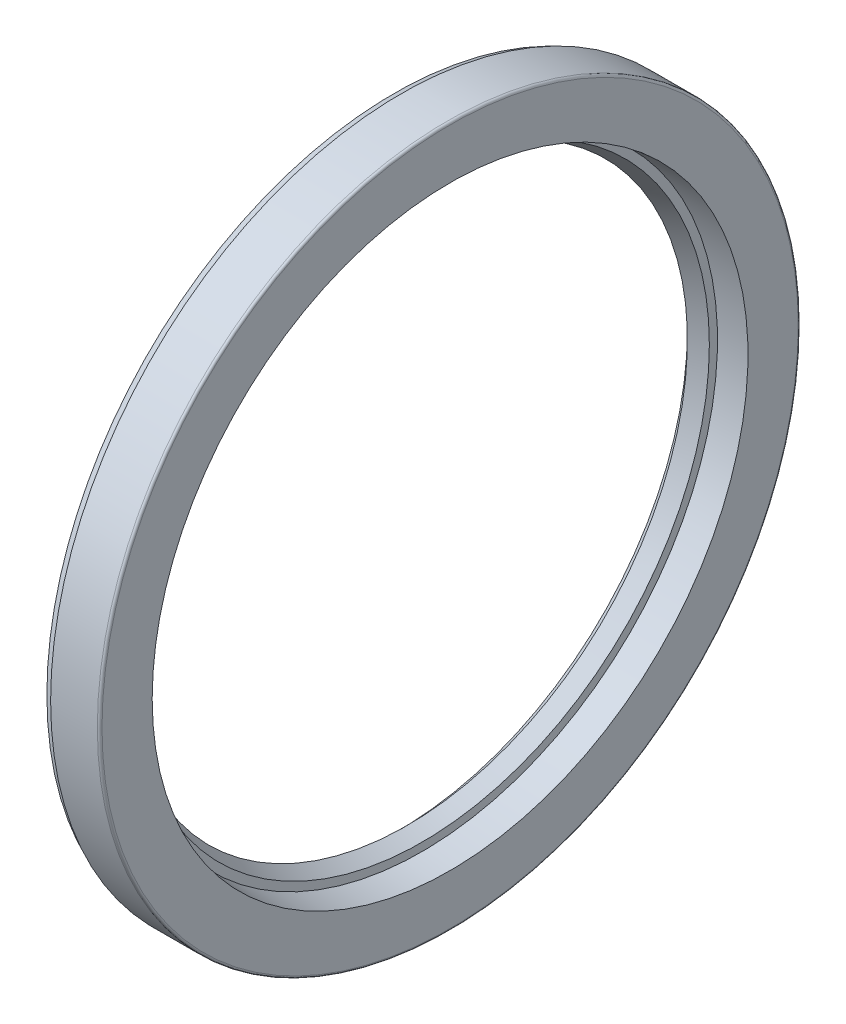
ISO-10303-21;
HEADER;
FILE_DESCRIPTION(('STEP AP214'),'2;1');
FILE_NAME('part.step','',(''),(''),'','','');
FILE_SCHEMA(('AUTOMOTIVE_DESIGN { 1 0 10303 214 1 1 1 1 }'));
ENDSEC;
DATA;
#1=APPLICATION_CONTEXT('core data for automotive mechanical design processes');
#2=APPLICATION_PROTOCOL_DEFINITION('international standard','automotive_design',2000,#1);
#3=PRODUCT_CONTEXT('',#1,'mechanical');
#4=PRODUCT('Part','Part','',(#3));
#5=PRODUCT_RELATED_PRODUCT_CATEGORY('part','',(#4));
#6=PRODUCT_DEFINITION_FORMATION('','',#4);
#7=PRODUCT_DEFINITION_CONTEXT('part definition',#1,'design');
#8=PRODUCT_DEFINITION('design','',#6,#7);
#9=PRODUCT_DEFINITION_SHAPE('','',#8);
#10=(LENGTH_UNIT() NAMED_UNIT(*) SI_UNIT(.MILLI.,.METRE.));
#11=(NAMED_UNIT(*) PLANE_ANGLE_UNIT() SI_UNIT($,.RADIAN.));
#12=(NAMED_UNIT(*) SI_UNIT($,.STERADIAN.) SOLID_ANGLE_UNIT());
#13=UNCERTAINTY_MEASURE_WITH_UNIT(LENGTH_MEASURE(1.E-05),#10,'distance_accuracy_value','');
#14=(GEOMETRIC_REPRESENTATION_CONTEXT(3) GLOBAL_UNCERTAINTY_ASSIGNED_CONTEXT((#13)) GLOBAL_UNIT_ASSIGNED_CONTEXT((#10,
#11,#12)) REPRESENTATION_CONTEXT('',''));
#15=CARTESIAN_POINT('',(0.,0.,0.));
#16=DIRECTION('',(0.,0.,1.));
#17=DIRECTION('',(1.,0.,0.));
#18=AXIS2_PLACEMENT_3D('',#15,#16,#17);
#19=CARTESIAN_POINT('',(-10.4988451556433,0.,0.));
#20=DIRECTION('',(1.,0.,0.));
#21=DIRECTION('',(0.,0.,-1.));
#22=AXIS2_PLACEMENT_3D('',#19,#20,#21);
#23=CONICAL_SURFACE('',#22,75.,0.43633231299858);
#24=CARTESIAN_POINT('',(-12.,0.,0.));
#25=DIRECTION('',(-1.,0.,0.));
#26=DIRECTION('',(0.,0.,1.));
#27=AXIS2_PLACEMENT_3D('',#24,#25,#26);
#28=CIRCLE('',#27,74.3);
#29=CARTESIAN_POINT('',(-12.,0.,74.3));
#30=VERTEX_POINT('',#29);
#31=EDGE_CURVE('E10',#30,#30,#28,.T.);
#32=ORIENTED_EDGE('',*,*,#31,.F.);
#33=EDGE_LOOP('',(#32));
#34=FACE_BOUND('',#33,.T.);
#35=CARTESIAN_POINT('',(-10.4988451556433,0.,0.));
#36=DIRECTION('',(-1.,0.,0.));
#37=DIRECTION('',(0.,0.,1.));
#38=AXIS2_PLACEMENT_3D('',#35,#36,#37);
#39=CIRCLE('',#38,75.);
#40=CARTESIAN_POINT('',(-10.4988451556433,0.,75.));
#41=VERTEX_POINT('',#40);
#42=EDGE_CURVE('E70',#41,#41,#39,.T.);
#43=ORIENTED_EDGE('',*,*,#42,.T.);
#44=EDGE_LOOP('',(#43));
#45=FACE_BOUND('',#44,.T.);
#46=ADVANCED_FACE('F15',(#34,#45),#23,.T.);
#47=CARTESIAN_POINT('',(-12.,74.3,0.));
#48=DIRECTION('',(1.,0.,0.));
#49=DIRECTION('',(0.,0.,-1.));
#50=AXIS2_PLACEMENT_3D('',#47,#48,#49);
#51=PLANE('',#50);
#52=CARTESIAN_POINT('',(-12.,0.,0.));
#53=DIRECTION('',(-1.,0.,0.));
#54=DIRECTION('',(0.,0.,1.));
#55=AXIS2_PLACEMENT_3D('',#52,#53,#54);
#56=CIRCLE('',#55,67.5);
#57=CARTESIAN_POINT('',(-12.,0.,67.5));
#58=VERTEX_POINT('',#57);
#59=EDGE_CURVE('E21',#58,#58,#56,.T.);
#60=ORIENTED_EDGE('',*,*,#59,.F.);
#61=EDGE_LOOP('',(#60));
#62=FACE_BOUND('',#61,.T.);
#63=ORIENTED_EDGE('',*,*,#31,.T.);
#64=EDGE_LOOP('',(#63));
#65=FACE_BOUND('',#64,.T.);
#66=ADVANCED_FACE('F161',(#62,#65),#51,.F.);
#67=CARTESIAN_POINT('',(-12.,0.,0.));
#68=DIRECTION('',(-1.,0.,0.));
#69=DIRECTION('',(0.,0.,1.));
#70=AXIS2_PLACEMENT_3D('',#67,#68,#69);
#71=CYLINDRICAL_SURFACE('',#70,67.5);
#72=CARTESIAN_POINT('',(-1.5,0.,0.));
#73=DIRECTION('',(-1.,0.,0.));
#74=DIRECTION('',(0.,0.,1.));
#75=AXIS2_PLACEMENT_3D('',#72,#73,#74);
#76=CIRCLE('',#75,67.5);
#77=CARTESIAN_POINT('',(-1.5,0.,67.5));
#78=VERTEX_POINT('',#77);
#79=EDGE_CURVE('E25',#78,#78,#76,.T.);
#80=ORIENTED_EDGE('',*,*,#79,.F.);
#81=EDGE_LOOP('',(#80));
#82=FACE_BOUND('',#81,.T.);
#83=ORIENTED_EDGE('',*,*,#59,.T.);
#84=EDGE_LOOP('',(#83));
#85=FACE_BOUND('',#84,.T.);
#86=ADVANCED_FACE('F156',(#82,#85),#71,.F.);
#87=CARTESIAN_POINT('',(-1.5,67.5,0.));
#88=DIRECTION('',(1.,0.,0.));
#89=DIRECTION('',(0.,0.,-1.));
#90=AXIS2_PLACEMENT_3D('',#87,#88,#89);
#91=PLANE('',#90);
#92=CARTESIAN_POINT('',(-1.5,0.,0.));
#93=DIRECTION('',(-1.,0.,0.));
#94=DIRECTION('',(0.,0.,1.));
#95=AXIS2_PLACEMENT_3D('',#92,#93,#94);
#96=CIRCLE('',#95,65.865);
#97=CARTESIAN_POINT('',(-1.5,0.,65.865));
#98=VERTEX_POINT('',#97);
#99=EDGE_CURVE('E29',#98,#98,#96,.T.);
#100=ORIENTED_EDGE('',*,*,#99,.F.);
#101=EDGE_LOOP('',(#100));
#102=FACE_BOUND('',#101,.T.);
#103=ORIENTED_EDGE('',*,*,#79,.T.);
#104=EDGE_LOOP('',(#103));
#105=FACE_BOUND('',#104,.T.);
#106=ADVANCED_FACE('F150',(#102,#105),#91,.F.);
#107=CARTESIAN_POINT('',(-1.5,0.,0.));
#108=DIRECTION('',(1.,0.,0.));
#109=DIRECTION('',(0.,0.,-1.));
#110=AXIS2_PLACEMENT_3D('',#107,#108,#109);
#111=CONICAL_SURFACE('',#110,65.865,0.261799387799145);
#112=CARTESIAN_POINT('',(-3.,0.,0.));
#113=DIRECTION('',(-1.,0.,0.));
#114=DIRECTION('',(0.,0.,1.));
#115=AXIS2_PLACEMENT_3D('',#112,#113,#114);
#116=CIRCLE('',#115,65.4630762113533);
#117=CARTESIAN_POINT('',(-3.,0.,65.4630762113533));
#118=VERTEX_POINT('',#117);
#119=EDGE_CURVE('E34',#118,#118,#116,.T.);
#120=ORIENTED_EDGE('',*,*,#119,.F.);
#121=EDGE_LOOP('',(#120));
#122=FACE_BOUND('',#121,.T.);
#123=ORIENTED_EDGE('',*,*,#99,.T.);
#124=EDGE_LOOP('',(#123));
#125=FACE_BOUND('',#124,.T.);
#126=ADVANCED_FACE('F144',(#122,#125),#111,.T.);
#127=CARTESIAN_POINT('',(-3.,65.4630762113533,0.));
#128=DIRECTION('',(1.,0.,0.));
#129=DIRECTION('',(0.,0.,-1.));
#130=AXIS2_PLACEMENT_3D('',#127,#128,#129);
#131=PLANE('',#130);
#132=CARTESIAN_POINT('',(-3.,0.,0.));
#133=DIRECTION('',(-1.,0.,0.));
#134=DIRECTION('',(0.,0.,1.));
#135=AXIS2_PLACEMENT_3D('',#132,#133,#134);
#136=CIRCLE('',#135,64.9);
#137=CARTESIAN_POINT('',(-3.,0.,64.9));
#138=VERTEX_POINT('',#137);
#139=EDGE_CURVE('E37',#138,#138,#136,.T.);
#140=ORIENTED_EDGE('',*,*,#139,.F.);
#141=EDGE_LOOP('',(#140));
#142=FACE_BOUND('',#141,.T.);
#143=ORIENTED_EDGE('',*,*,#119,.T.);
#144=EDGE_LOOP('',(#143));
#145=FACE_BOUND('',#144,.T.);
#146=ADVANCED_FACE('F138',(#142,#145),#131,.F.);
#147=CARTESIAN_POINT('',(-3.,0.,0.));
#148=DIRECTION('',(1.,0.,0.));
#149=DIRECTION('',(0.,0.,-1.));
#150=AXIS2_PLACEMENT_3D('',#147,#148,#149);
#151=CONICAL_SURFACE('',#150,64.9,0.087266462599712);
#152=CARTESIAN_POINT('',(-7.90076498212069,0.,0.));
#153=DIRECTION('',(-1.,0.,0.));
#154=DIRECTION('',(0.,0.,1.));
#155=AXIS2_PLACEMENT_3D('',#152,#153,#154);
#156=CIRCLE('',#155,64.4712386214596);
#157=CARTESIAN_POINT('',(-7.90076498212069,0.,64.4712386214596));
#158=VERTEX_POINT('',#157);
#159=EDGE_CURVE('E40',#158,#158,#156,.T.);
#160=ORIENTED_EDGE('',*,*,#159,.F.);
#161=EDGE_LOOP('',(#160));
#162=FACE_BOUND('',#161,.T.);
#163=ORIENTED_EDGE('',*,*,#139,.T.);
#164=EDGE_LOOP('',(#163));
#165=FACE_BOUND('',#164,.T.);
#166=ADVANCED_FACE('F132',(#162,#165),#151,.T.);
#167=CARTESIAN_POINT('',(-8.6,0.,0.));
#168=DIRECTION('',(-1.,0.,0.));
#169=DIRECTION('',(0.,0.,1.));
#170=AXIS2_PLACEMENT_3D('',#167,#168,#169);
#171=TOROIDAL_SURFACE('',#170,64.2,0.75);
#172=CARTESIAN_POINT('',(-8.9697265625,0.,0.));
#173=DIRECTION('',(-1.,0.,0.));
#174=DIRECTION('',(0.,0.,1.));
#175=AXIS2_PLACEMENT_3D('',#172,#173,#174);
#176=CIRCLE('',#175,64.8525352626349);
#177=CARTESIAN_POINT('',(-8.9697265625,0.,64.8525352626349));
#178=VERTEX_POINT('',#177);
#179=EDGE_CURVE('E43',#178,#178,#176,.T.);
#180=ORIENTED_EDGE('',*,*,#179,.F.);
#181=EDGE_LOOP('',(#180));
#182=FACE_BOUND('',#181,.T.);
#183=ORIENTED_EDGE('',*,*,#159,.T.);
#184=EDGE_LOOP('',(#183));
#185=FACE_BOUND('',#184,.T.);
#186=ADVANCED_FACE('F126',(#182,#185),#171,.T.);
#187=CARTESIAN_POINT('',(-9.88,0.,0.));
#188=DIRECTION('',(-1.,0.,0.));
#189=DIRECTION('',(0.,0.,1.));
#190=AXIS2_PLACEMENT_3D('',#187,#188,#189);
#191=TOROIDAL_SURFACE('',#190,64.2,1.12);
#192=CARTESIAN_POINT('',(-11.,0.,0.));
#193=DIRECTION('',(-1.,0.,0.));
#194=DIRECTION('',(0.,0.,1.));
#195=AXIS2_PLACEMENT_3D('',#192,#193,#194);
#196=CIRCLE('',#195,64.2);
#197=CARTESIAN_POINT('',(-11.,0.,64.2));
#198=VERTEX_POINT('',#197);
#199=EDGE_CURVE('E46',#198,#198,#196,.T.);
#200=ORIENTED_EDGE('',*,*,#199,.F.);
#201=EDGE_LOOP('',(#200));
#202=FACE_BOUND('',#201,.T.);
#203=ORIENTED_EDGE('',*,*,#179,.T.);
#204=EDGE_LOOP('',(#203));
#205=FACE_BOUND('',#204,.T.);
#206=ADVANCED_FACE('F120',(#202,#205),#191,.T.);
#207=CARTESIAN_POINT('',(-11.,64.2,0.));
#208=DIRECTION('',(1.,0.,0.));
#209=DIRECTION('',(0.,0.,-1.));
#210=AXIS2_PLACEMENT_3D('',#207,#208,#209);
#211=PLANE('',#210);
#212=CARTESIAN_POINT('',(-11.,0.,0.));
#213=DIRECTION('',(-1.,0.,0.));
#214=DIRECTION('',(0.,0.,1.));
#215=AXIS2_PLACEMENT_3D('',#212,#213,#214);
#216=CIRCLE('',#215,61.8);
#217=CARTESIAN_POINT('',(-11.,0.,61.8));
#218=VERTEX_POINT('',#217);
#219=EDGE_CURVE('E49',#218,#218,#216,.T.);
#220=ORIENTED_EDGE('',*,*,#219,.F.);
#221=EDGE_LOOP('',(#220));
#222=FACE_BOUND('',#221,.T.);
#223=ORIENTED_EDGE('',*,*,#199,.T.);
#224=EDGE_LOOP('',(#223));
#225=FACE_BOUND('',#224,.T.);
#226=ADVANCED_FACE('F114',(#222,#225),#211,.F.);
#227=CARTESIAN_POINT('',(-11.,0.,0.));
#228=DIRECTION('',(-1.,0.,0.));
#229=DIRECTION('',(0.,0.,1.));
#230=AXIS2_PLACEMENT_3D('',#227,#228,#229);
#231=CONICAL_SURFACE('',#230,61.8,0.785398163397445);
#232=CARTESIAN_POINT('',(-9.2,0.,0.));
#233=DIRECTION('',(-1.,0.,0.));
#234=DIRECTION('',(0.,0.,1.));
#235=AXIS2_PLACEMENT_3D('',#232,#233,#234);
#236=CIRCLE('',#235,60.);
#237=CARTESIAN_POINT('',(-9.2,0.,60.));
#238=VERTEX_POINT('',#237);
#239=EDGE_CURVE('E52',#238,#238,#236,.T.);
#240=ORIENTED_EDGE('',*,*,#239,.F.);
#241=EDGE_LOOP('',(#240));
#242=FACE_BOUND('',#241,.T.);
#243=ORIENTED_EDGE('',*,*,#219,.T.);
#244=EDGE_LOOP('',(#243));
#245=FACE_BOUND('',#244,.T.);
#246=ADVANCED_FACE('F108',(#242,#245),#231,.F.);
#247=CARTESIAN_POINT('',(-9.2,0.,0.));
#248=DIRECTION('',(1.,0.,0.));
#249=DIRECTION('',(0.,0.,-1.));
#250=AXIS2_PLACEMENT_3D('',#247,#248,#249);
#251=CONICAL_SURFACE('',#250,60.,0.436332312998587);
#252=CARTESIAN_POINT('',(-6.,0.,0.));
#253=DIRECTION('',(-1.,0.,0.));
#254=DIRECTION('',(0.,0.,1.));
#255=AXIS2_PLACEMENT_3D('',#252,#253,#254);
#256=CIRCLE('',#255,61.492184506096);
#257=CARTESIAN_POINT('',(-6.,0.,61.492184506096));
#258=VERTEX_POINT('',#257);
#259=EDGE_CURVE('E55',#258,#258,#256,.T.);
#260=ORIENTED_EDGE('',*,*,#259,.F.);
#261=EDGE_LOOP('',(#260));
#262=FACE_BOUND('',#261,.T.);
#263=ORIENTED_EDGE('',*,*,#239,.T.);
#264=EDGE_LOOP('',(#263));
#265=FACE_BOUND('',#264,.T.);
#266=ADVANCED_FACE('F102',(#262,#265),#251,.F.);
#267=CARTESIAN_POINT('',(-6.,61.492184506096,0.));
#268=DIRECTION('',(-1.,0.,0.));
#269=DIRECTION('',(0.,0.,1.));
#270=AXIS2_PLACEMENT_3D('',#267,#268,#269);
#271=PLANE('',#270);
#272=CARTESIAN_POINT('',(-6.,0.,0.));
#273=DIRECTION('',(-1.,0.,0.));
#274=DIRECTION('',(0.,0.,1.));
#275=AXIS2_PLACEMENT_3D('',#272,#273,#274);
#276=CIRCLE('',#275,63.2350680188445);
#277=CARTESIAN_POINT('',(-6.,0.,63.2350680188445));
#278=VERTEX_POINT('',#277);
#279=EDGE_CURVE('E58',#278,#278,#276,.T.);
#280=ORIENTED_EDGE('',*,*,#279,.F.);
#281=EDGE_LOOP('',(#280));
#282=FACE_BOUND('',#281,.T.);
#283=ORIENTED_EDGE('',*,*,#259,.T.);
#284=EDGE_LOOP('',(#283));
#285=FACE_BOUND('',#284,.T.);
#286=ADVANCED_FACE('F96',(#282,#285),#271,.F.);
#287=CARTESIAN_POINT('',(-6.,0.,0.));
#288=DIRECTION('',(1.,0.,0.));
#289=DIRECTION('',(0.,0.,-1.));
#290=AXIS2_PLACEMENT_3D('',#287,#288,#289);
#291=CONICAL_SURFACE('',#290,63.2350680188445,0.0872664625997132);
#292=CARTESIAN_POINT('',(0.,0.,0.));
#293=DIRECTION('',(-1.,0.,0.));
#294=DIRECTION('',(0.,0.,1.));
#295=AXIS2_PLACEMENT_3D('',#292,#293,#294);
#296=CIRCLE('',#295,63.76);
#297=CARTESIAN_POINT('',(0.,0.,63.76));
#298=VERTEX_POINT('',#297);
#299=EDGE_CURVE('E61',#298,#298,#296,.T.);
#300=ORIENTED_EDGE('',*,*,#299,.F.);
#301=EDGE_LOOP('',(#300));
#302=FACE_BOUND('',#301,.T.);
#303=ORIENTED_EDGE('',*,*,#279,.T.);
#304=EDGE_LOOP('',(#303));
#305=FACE_BOUND('',#304,.T.);
#306=ADVANCED_FACE('F90',(#302,#305),#291,.F.);
#307=CARTESIAN_POINT('',(0.,63.76,0.));
#308=DIRECTION('',(-1.,0.,0.));
#309=DIRECTION('',(0.,0.,1.));
#310=AXIS2_PLACEMENT_3D('',#307,#308,#309);
#311=PLANE('',#310);
#312=CARTESIAN_POINT('',(0.,0.,0.));
#313=DIRECTION('',(-1.,0.,0.));
#314=DIRECTION('',(0.,0.,1.));
#315=AXIS2_PLACEMENT_3D('',#312,#313,#314);
#316=CIRCLE('',#315,74.5);
#317=CARTESIAN_POINT('',(0.,0.,74.5));
#318=VERTEX_POINT('',#317);
#319=EDGE_CURVE('E64',#318,#318,#316,.T.);
#320=ORIENTED_EDGE('',*,*,#319,.F.);
#321=EDGE_LOOP('',(#320));
#322=FACE_BOUND('',#321,.T.);
#323=ORIENTED_EDGE('',*,*,#299,.T.);
#324=EDGE_LOOP('',(#323));
#325=FACE_BOUND('',#324,.T.);
#326=ADVANCED_FACE('F84',(#322,#325),#311,.F.);
#327=CARTESIAN_POINT('',(-0.5,0.,0.));
#328=DIRECTION('',(-1.,0.,0.));
#329=DIRECTION('',(0.,0.,1.));
#330=AXIS2_PLACEMENT_3D('',#327,#328,#329);
#331=TOROIDAL_SURFACE('',#330,74.5,0.5);
#332=CARTESIAN_POINT('',(-0.5,0.,0.));
#333=DIRECTION('',(-1.,0.,0.));
#334=DIRECTION('',(0.,0.,1.));
#335=AXIS2_PLACEMENT_3D('',#332,#333,#334);
#336=CIRCLE('',#335,75.);
#337=CARTESIAN_POINT('',(-0.5,0.,75.));
#338=VERTEX_POINT('',#337);
#339=EDGE_CURVE('E67',#338,#338,#336,.T.);
#340=ORIENTED_EDGE('',*,*,#339,.F.);
#341=EDGE_LOOP('',(#340));
#342=FACE_BOUND('',#341,.T.);
#343=ORIENTED_EDGE('',*,*,#319,.T.);
#344=EDGE_LOOP('',(#343));
#345=FACE_BOUND('',#344,.T.);
#346=ADVANCED_FACE('F78',(#342,#345),#331,.T.);
#347=CARTESIAN_POINT('',(-12.,0.,0.));
#348=DIRECTION('',(-1.,0.,0.));
#349=DIRECTION('',(0.,0.,1.));
#350=AXIS2_PLACEMENT_3D('',#347,#348,#349);
#351=CYLINDRICAL_SURFACE('',#350,75.);
#352=ORIENTED_EDGE('',*,*,#42,.F.);
#353=EDGE_LOOP('',(#352));
#354=FACE_BOUND('',#353,.T.);
#355=ORIENTED_EDGE('',*,*,#339,.T.);
#356=EDGE_LOOP('',(#355));
#357=FACE_BOUND('',#356,.T.);
#358=ADVANCED_FACE('F75',(#354,#357),#351,.T.);
#359=CLOSED_SHELL('',(#46,#66,#86,#106,#126,#146,#166,#186,#206,#226,#246,#266,#286,#306,#326,
#346,#358));
#360=MANIFOLD_SOLID_BREP('B1',#359);
#361=ADVANCED_BREP_SHAPE_REPRESENTATION('',(#18,#360),#14);
#362=SHAPE_DEFINITION_REPRESENTATION(#9,#361);
ENDSEC;
END-ISO-10303-21;
